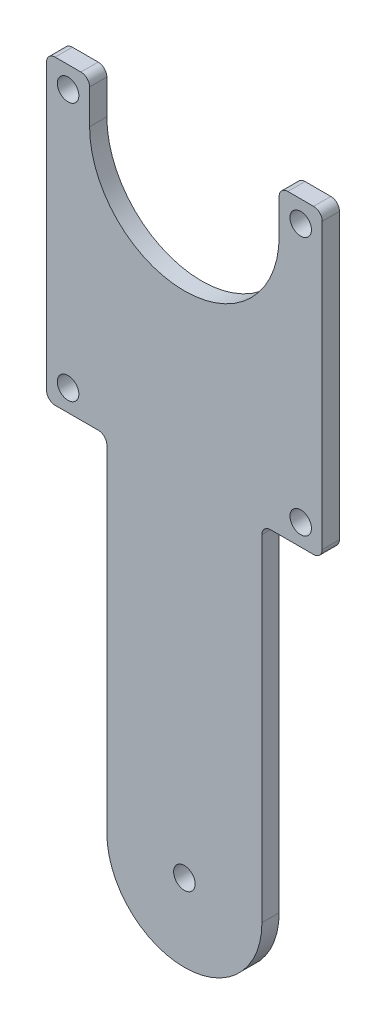
ISO-10303-21;
HEADER;
FILE_DESCRIPTION(('STEP AP214'),'2;1');
FILE_NAME('part.step','',(''),(''),'','','');
FILE_SCHEMA(('AUTOMOTIVE_DESIGN { 1 0 10303 214 1 1 1 1 }'));
ENDSEC;
DATA;
#1=APPLICATION_CONTEXT('core data for automotive mechanical design processes');
#2=APPLICATION_PROTOCOL_DEFINITION('international standard','automotive_design',2000,#1);
#3=PRODUCT_CONTEXT('',#1,'mechanical');
#4=PRODUCT('Part','Part','',(#3));
#5=PRODUCT_RELATED_PRODUCT_CATEGORY('part','',(#4));
#6=PRODUCT_DEFINITION_FORMATION('','',#4);
#7=PRODUCT_DEFINITION_CONTEXT('part definition',#1,'design');
#8=PRODUCT_DEFINITION('design','',#6,#7);
#9=PRODUCT_DEFINITION_SHAPE('','',#8);
#10=(LENGTH_UNIT() NAMED_UNIT(*) SI_UNIT(.MILLI.,.METRE.));
#11=(NAMED_UNIT(*) PLANE_ANGLE_UNIT() SI_UNIT($,.RADIAN.));
#12=(NAMED_UNIT(*) SI_UNIT($,.STERADIAN.) SOLID_ANGLE_UNIT());
#13=UNCERTAINTY_MEASURE_WITH_UNIT(LENGTH_MEASURE(1.E-05),#10,'distance_accuracy_value','');
#14=(GEOMETRIC_REPRESENTATION_CONTEXT(3) GLOBAL_UNCERTAINTY_ASSIGNED_CONTEXT((#13)) GLOBAL_UNIT_ASSIGNED_CONTEXT((#10,
#11,#12)) REPRESENTATION_CONTEXT('',''));
#15=CARTESIAN_POINT('',(0.,0.,0.));
#16=DIRECTION('',(0.,0.,1.));
#17=DIRECTION('',(1.,0.,0.));
#18=AXIS2_PLACEMENT_3D('',#15,#16,#17);
#19=CARTESIAN_POINT('',(23.0486139328405,-14.404186251909,2.));
#20=DIRECTION('',(0.,0.,-1.));
#21=DIRECTION('',(-1.,0.,0.));
#22=AXIS2_PLACEMENT_3D('',#19,#20,#21);
#23=CYLINDRICAL_SURFACE('',#22,1.);
#24=CARTESIAN_POINT('',(23.0486139328405,-14.404186251909,0.));
#25=DIRECTION('',(0.,0.,1.));
#26=DIRECTION('',(1.,0.,0.));
#27=AXIS2_PLACEMENT_3D('',#24,#25,#26);
#28=CIRCLE('',#27,1.);
#29=CARTESIAN_POINT('',(24.0486139328405,-14.404186251909,0.));
#30=VERTEX_POINT('',#29);
#31=CARTESIAN_POINT('',(23.0486139328405,-15.404186251909,0.));
#32=VERTEX_POINT('',#31);
#33=EDGE_CURVE('E214',#30,#32,#28,.F.);
#34=ORIENTED_EDGE('',*,*,#33,.F.);
#35=DIRECTION('',(0.,0.,-1.));
#36=VECTOR('',#35,1.);
#37=CARTESIAN_POINT('',(24.0486139328405,-14.404186251909,2.));
#38=LINE('',#37,#36);
#39=CARTESIAN_POINT('',(24.0486139328405,-14.404186251909,2.));
#40=VERTEX_POINT('',#39);
#41=EDGE_CURVE('E11',#40,#30,#38,.T.);
#42=ORIENTED_EDGE('',*,*,#41,.F.);
#43=CARTESIAN_POINT('',(23.0486139328405,-14.404186251909,2.));
#44=DIRECTION('',(0.,0.,1.));
#45=DIRECTION('',(1.,0.,0.));
#46=AXIS2_PLACEMENT_3D('',#43,#44,#45);
#47=CIRCLE('',#46,1.);
#48=CARTESIAN_POINT('',(23.0486139328405,-15.404186251909,2.));
#49=VERTEX_POINT('',#48);
#50=EDGE_CURVE('E276',#40,#49,#47,.F.);
#51=ORIENTED_EDGE('',*,*,#50,.T.);
#52=DIRECTION('',(0.,0.,-1.));
#53=VECTOR('',#52,1.);
#54=CARTESIAN_POINT('',(23.0486139328405,-15.404186251909,2.));
#55=LINE('',#54,#53);
#56=EDGE_CURVE('E50',#49,#32,#55,.T.);
#57=ORIENTED_EDGE('',*,*,#56,.T.);
#58=EDGE_LOOP('',(#34,#42,#51,#57));
#59=FACE_BOUND('',#58,.T.);
#60=ADVANCED_FACE('F34',(#59),#23,.T.);
#61=CARTESIAN_POINT('',(24.0486139328405,0.,2.));
#62=DIRECTION('',(1.,0.,0.));
#63=DIRECTION('',(0.,1.,0.));
#64=AXIS2_PLACEMENT_3D('',#61,#62,#63);
#65=PLANE('',#64);
#66=DIRECTION('',(0.,-1.,0.));
#67=VECTOR('',#66,1.);
#68=CARTESIAN_POINT('',(24.0486139328405,0.,0.));
#69=LINE('',#68,#67);
#70=CARTESIAN_POINT('',(24.0486139328405,18.595813748091,0.));
#71=VERTEX_POINT('',#70);
#72=EDGE_CURVE('E216',#71,#30,#69,.T.);
#73=ORIENTED_EDGE('',*,*,#72,.F.);
#74=DIRECTION('',(0.,0.,-1.));
#75=VECTOR('',#74,1.);
#76=CARTESIAN_POINT('',(24.0486139328405,18.595813748091,2.));
#77=LINE('',#76,#75);
#78=CARTESIAN_POINT('',(24.0486139328405,18.595813748091,2.));
#79=VERTEX_POINT('',#78);
#80=EDGE_CURVE('E42',#79,#71,#77,.T.);
#81=ORIENTED_EDGE('',*,*,#80,.F.);
#82=DIRECTION('',(0.,-1.,0.));
#83=VECTOR('',#82,1.);
#84=CARTESIAN_POINT('',(24.0486139328405,0.,2.));
#85=LINE('',#84,#83);
#86=EDGE_CURVE('E339',#79,#40,#85,.T.);
#87=ORIENTED_EDGE('',*,*,#86,.T.);
#88=ORIENTED_EDGE('',*,*,#41,.T.);
#89=EDGE_LOOP('',(#73,#81,#87,#88));
#90=FACE_BOUND('',#89,.T.);
#91=ADVANCED_FACE('F326',(#90),#65,.T.);
#92=CARTESIAN_POINT('',(23.0486139328405,18.595813748091,2.));
#93=DIRECTION('',(0.,0.,-1.));
#94=DIRECTION('',(-1.,0.,0.));
#95=AXIS2_PLACEMENT_3D('',#92,#93,#94);
#96=CYLINDRICAL_SURFACE('',#95,1.);
#97=CARTESIAN_POINT('',(23.0486139328405,18.595813748091,0.));
#98=DIRECTION('',(0.,0.,1.));
#99=DIRECTION('',(1.,0.,0.));
#100=AXIS2_PLACEMENT_3D('',#97,#98,#99);
#101=CIRCLE('',#100,1.);
#102=CARTESIAN_POINT('',(23.0486139328405,19.595813748091,0.));
#103=VERTEX_POINT('',#102);
#104=EDGE_CURVE('E219',#103,#71,#101,.F.);
#105=ORIENTED_EDGE('',*,*,#104,.F.);
#106=DIRECTION('',(0.,0.,-1.));
#107=VECTOR('',#106,1.);
#108=CARTESIAN_POINT('',(23.0486139328405,19.595813748091,2.));
#109=LINE('',#108,#107);
#110=CARTESIAN_POINT('',(23.0486139328405,19.595813748091,2.));
#111=VERTEX_POINT('',#110);
#112=EDGE_CURVE('E315',#111,#103,#109,.T.);
#113=ORIENTED_EDGE('',*,*,#112,.F.);
#114=CARTESIAN_POINT('',(23.0486139328405,18.595813748091,2.));
#115=DIRECTION('',(0.,0.,1.));
#116=DIRECTION('',(1.,0.,0.));
#117=AXIS2_PLACEMENT_3D('',#114,#115,#116);
#118=CIRCLE('',#117,1.);
#119=EDGE_CURVE('E322',#111,#79,#118,.F.);
#120=ORIENTED_EDGE('',*,*,#119,.T.);
#121=ORIENTED_EDGE('',*,*,#80,.T.);
#122=EDGE_LOOP('',(#105,#113,#120,#121));
#123=FACE_BOUND('',#122,.T.);
#124=ADVANCED_FACE('F320',(#123),#96,.T.);
#125=CARTESIAN_POINT('',(0.,19.595813748091,2.));
#126=DIRECTION('',(0.,1.,0.));
#127=DIRECTION('',(0.,0.,1.));
#128=AXIS2_PLACEMENT_3D('',#125,#126,#127);
#129=PLANE('',#128);
#130=DIRECTION('',(1.,0.,0.));
#131=VECTOR('',#130,1.);
#132=CARTESIAN_POINT('',(0.,19.595813748091,0.));
#133=LINE('',#132,#131);
#134=CARTESIAN_POINT('',(20.0486139328405,19.595813748091,0.));
#135=VERTEX_POINT('',#134);
#136=EDGE_CURVE('E222',#135,#103,#133,.T.);
#137=ORIENTED_EDGE('',*,*,#136,.F.);
#138=DIRECTION('',(0.,0.,-1.));
#139=VECTOR('',#138,1.);
#140=CARTESIAN_POINT('',(20.0486139328405,19.595813748091,2.));
#141=LINE('',#140,#139);
#142=CARTESIAN_POINT('',(20.0486139328405,19.595813748091,2.));
#143=VERTEX_POINT('',#142);
#144=EDGE_CURVE('E313',#143,#135,#141,.T.);
#145=ORIENTED_EDGE('',*,*,#144,.F.);
#146=DIRECTION('',(1.,0.,0.));
#147=VECTOR('',#146,1.);
#148=CARTESIAN_POINT('',(0.,19.595813748091,2.));
#149=LINE('',#148,#147);
#150=EDGE_CURVE('E338',#143,#111,#149,.T.);
#151=ORIENTED_EDGE('',*,*,#150,.T.);
#152=ORIENTED_EDGE('',*,*,#112,.T.);
#153=EDGE_LOOP('',(#137,#145,#151,#152));
#154=FACE_BOUND('',#153,.T.);
#155=ADVANCED_FACE('F334',(#154),#129,.T.);
#156=CARTESIAN_POINT('',(20.0486139328405,18.595813748091,2.));
#157=DIRECTION('',(0.,0.,-1.));
#158=DIRECTION('',(-1.,0.,0.));
#159=AXIS2_PLACEMENT_3D('',#156,#157,#158);
#160=CYLINDRICAL_SURFACE('',#159,1.);
#161=CARTESIAN_POINT('',(20.0486139328405,18.595813748091,0.));
#162=DIRECTION('',(0.,0.,1.));
#163=DIRECTION('',(1.,0.,0.));
#164=AXIS2_PLACEMENT_3D('',#161,#162,#163);
#165=CIRCLE('',#164,1.);
#166=CARTESIAN_POINT('',(19.0486139328405,18.595813748091,0.));
#167=VERTEX_POINT('',#166);
#168=EDGE_CURVE('E225',#135,#167,#165,.T.);
#169=ORIENTED_EDGE('',*,*,#168,.T.);
#170=DIRECTION('',(0.,0.,-1.));
#171=VECTOR('',#170,1.);
#172=CARTESIAN_POINT('',(19.0486139328405,18.595813748091,2.));
#173=LINE('',#172,#171);
#174=CARTESIAN_POINT('',(19.0486139328405,18.595813748091,2.));
#175=VERTEX_POINT('',#174);
#176=EDGE_CURVE('E310',#175,#167,#173,.T.);
#177=ORIENTED_EDGE('',*,*,#176,.F.);
#178=CARTESIAN_POINT('',(20.0486139328405,18.595813748091,2.));
#179=DIRECTION('',(0.,0.,1.));
#180=DIRECTION('',(1.,0.,0.));
#181=AXIS2_PLACEMENT_3D('',#178,#179,#180);
#182=CIRCLE('',#181,1.);
#183=EDGE_CURVE('E341',#143,#175,#182,.T.);
#184=ORIENTED_EDGE('',*,*,#183,.F.);
#185=ORIENTED_EDGE('',*,*,#144,.T.);
#186=EDGE_LOOP('',(#169,#177,#184,#185));
#187=FACE_BOUND('',#186,.T.);
#188=ADVANCED_FACE('F406',(#187),#160,.T.);
#189=CARTESIAN_POINT('',(19.0486139328405,0.,2.));
#190=DIRECTION('',(1.,0.,0.));
#191=DIRECTION('',(0.,0.,-1.));
#192=AXIS2_PLACEMENT_3D('',#189,#190,#191);
#193=PLANE('',#192);
#194=DIRECTION('',(0.,-1.,0.));
#195=VECTOR('',#194,1.);
#196=CARTESIAN_POINT('',(19.0486139328405,0.,0.));
#197=LINE('',#196,#195);
#198=CARTESIAN_POINT('',(19.0486139328405,14.595813748091,0.));
#199=VERTEX_POINT('',#198);
#200=EDGE_CURVE('E227',#167,#199,#197,.T.);
#201=ORIENTED_EDGE('',*,*,#200,.T.);
#202=DIRECTION('',(0.,0.,-1.));
#203=VECTOR('',#202,1.);
#204=CARTESIAN_POINT('',(19.0486139328405,14.595813748091,2.));
#205=LINE('',#204,#203);
#206=CARTESIAN_POINT('',(19.0486139328405,14.595813748091,2.));
#207=VERTEX_POINT('',#206);
#208=EDGE_CURVE('E307',#207,#199,#205,.T.);
#209=ORIENTED_EDGE('',*,*,#208,.F.);
#210=DIRECTION('',(0.,-1.,0.));
#211=VECTOR('',#210,1.);
#212=CARTESIAN_POINT('',(19.0486139328405,0.,2.));
#213=LINE('',#212,#211);
#214=EDGE_CURVE('E347',#175,#207,#213,.T.);
#215=ORIENTED_EDGE('',*,*,#214,.F.);
#216=ORIENTED_EDGE('',*,*,#176,.T.);
#217=EDGE_LOOP('',(#201,#209,#215,#216));
#218=FACE_BOUND('',#217,.T.);
#219=ADVANCED_FACE('F409',(#218),#193,.F.);
#220=CARTESIAN_POINT('',(8.04861393284049,14.595813748091,2.));
#221=DIRECTION('',(0.,0.,-1.));
#222=DIRECTION('',(-1.,0.,0.));
#223=AXIS2_PLACEMENT_3D('',#220,#221,#222);
#224=CYLINDRICAL_SURFACE('',#223,11.);
#225=CARTESIAN_POINT('',(8.04861393284049,14.595813748091,0.));
#226=DIRECTION('',(0.,0.,1.));
#227=DIRECTION('',(1.,0.,0.));
#228=AXIS2_PLACEMENT_3D('',#225,#226,#227);
#229=CIRCLE('',#228,11.);
#230=CARTESIAN_POINT('',(-2.95138606715951,14.595813748091,0.));
#231=VERTEX_POINT('',#230);
#232=EDGE_CURVE('E229',#199,#231,#229,.F.);
#233=ORIENTED_EDGE('',*,*,#232,.T.);
#234=DIRECTION('',(0.,0.,-1.));
#235=VECTOR('',#234,1.);
#236=CARTESIAN_POINT('',(-2.95138606715951,14.595813748091,2.));
#237=LINE('',#236,#235);
#238=CARTESIAN_POINT('',(-2.95138606715951,14.595813748091,2.));
#239=VERTEX_POINT('',#238);
#240=EDGE_CURVE('E304',#239,#231,#237,.T.);
#241=ORIENTED_EDGE('',*,*,#240,.F.);
#242=CARTESIAN_POINT('',(8.04861393284049,14.595813748091,2.));
#243=DIRECTION('',(0.,0.,1.));
#244=DIRECTION('',(1.,0.,0.));
#245=AXIS2_PLACEMENT_3D('',#242,#243,#244);
#246=CIRCLE('',#245,11.);
#247=EDGE_CURVE('E349',#207,#239,#246,.F.);
#248=ORIENTED_EDGE('',*,*,#247,.F.);
#249=ORIENTED_EDGE('',*,*,#208,.T.);
#250=EDGE_LOOP('',(#233,#241,#248,#249));
#251=FACE_BOUND('',#250,.T.);
#252=ADVANCED_FACE('F413',(#251),#224,.F.);
#253=CARTESIAN_POINT('',(-2.95138606715951,0.,2.));
#254=DIRECTION('',(-1.,0.,0.));
#255=DIRECTION('',(0.,0.,1.));
#256=AXIS2_PLACEMENT_3D('',#253,#254,#255);
#257=PLANE('',#256);
#258=DIRECTION('',(0.,1.,0.));
#259=VECTOR('',#258,1.);
#260=CARTESIAN_POINT('',(-2.95138606715951,0.,0.));
#261=LINE('',#260,#259);
#262=CARTESIAN_POINT('',(-2.95138606715951,18.595813748091,0.));
#263=VERTEX_POINT('',#262);
#264=EDGE_CURVE('E231',#231,#263,#261,.T.);
#265=ORIENTED_EDGE('',*,*,#264,.T.);
#266=DIRECTION('',(0.,0.,-1.));
#267=VECTOR('',#266,1.);
#268=CARTESIAN_POINT('',(-2.95138606715951,18.595813748091,2.));
#269=LINE('',#268,#267);
#270=CARTESIAN_POINT('',(-2.95138606715951,18.595813748091,2.));
#271=VERTEX_POINT('',#270);
#272=EDGE_CURVE('E302',#271,#263,#269,.T.);
#273=ORIENTED_EDGE('',*,*,#272,.F.);
#274=DIRECTION('',(0.,1.,0.));
#275=VECTOR('',#274,1.);
#276=CARTESIAN_POINT('',(-2.95138606715951,0.,2.));
#277=LINE('',#276,#275);
#278=EDGE_CURVE('E351',#239,#271,#277,.T.);
#279=ORIENTED_EDGE('',*,*,#278,.F.);
#280=ORIENTED_EDGE('',*,*,#240,.T.);
#281=EDGE_LOOP('',(#265,#273,#279,#280));
#282=FACE_BOUND('',#281,.T.);
#283=ADVANCED_FACE('F417',(#282),#257,.F.);
#284=CARTESIAN_POINT('',(-3.95138606715951,18.595813748091,2.));
#285=DIRECTION('',(0.,0.,-1.));
#286=DIRECTION('',(-1.,0.,0.));
#287=AXIS2_PLACEMENT_3D('',#284,#285,#286);
#288=CYLINDRICAL_SURFACE('',#287,1.);
#289=CARTESIAN_POINT('',(-3.95138606715951,18.595813748091,0.));
#290=DIRECTION('',(0.,0.,1.));
#291=DIRECTION('',(1.,0.,0.));
#292=AXIS2_PLACEMENT_3D('',#289,#290,#291);
#293=CIRCLE('',#292,1.);
#294=CARTESIAN_POINT('',(-3.95138606715952,19.595813748091,0.));
#295=VERTEX_POINT('',#294);
#296=EDGE_CURVE('E234',#295,#263,#293,.F.);
#297=ORIENTED_EDGE('',*,*,#296,.F.);
#298=DIRECTION('',(0.,0.,-1.));
#299=VECTOR('',#298,1.);
#300=CARTESIAN_POINT('',(-3.95138606715952,19.595813748091,2.));
#301=LINE('',#300,#299);
#302=CARTESIAN_POINT('',(-3.95138606715952,19.595813748091,2.));
#303=VERTEX_POINT('',#302);
#304=EDGE_CURVE('E300',#303,#295,#301,.T.);
#305=ORIENTED_EDGE('',*,*,#304,.F.);
#306=CARTESIAN_POINT('',(-3.95138606715951,18.595813748091,2.));
#307=DIRECTION('',(0.,0.,1.));
#308=DIRECTION('',(1.,0.,0.));
#309=AXIS2_PLACEMENT_3D('',#306,#307,#308);
#310=CIRCLE('',#309,1.);
#311=EDGE_CURVE('E353',#303,#271,#310,.F.);
#312=ORIENTED_EDGE('',*,*,#311,.T.);
#313=ORIENTED_EDGE('',*,*,#272,.T.);
#314=EDGE_LOOP('',(#297,#305,#312,#313));
#315=FACE_BOUND('',#314,.T.);
#316=ADVANCED_FACE('F421',(#315),#288,.T.);
#317=CARTESIAN_POINT('',(0.,19.595813748091,2.));
#318=DIRECTION('',(0.,1.,0.));
#319=DIRECTION('',(-1.,0.,0.));
#320=AXIS2_PLACEMENT_3D('',#317,#318,#319);
#321=PLANE('',#320);
#322=DIRECTION('',(1.,0.,0.));
#323=VECTOR('',#322,1.);
#324=CARTESIAN_POINT('',(0.,19.595813748091,0.));
#325=LINE('',#324,#323);
#326=CARTESIAN_POINT('',(-6.95138606715951,19.595813748091,0.));
#327=VERTEX_POINT('',#326);
#328=EDGE_CURVE('E237',#327,#295,#325,.T.);
#329=ORIENTED_EDGE('',*,*,#328,.F.);
#330=DIRECTION('',(0.,0.,-1.));
#331=VECTOR('',#330,1.);
#332=CARTESIAN_POINT('',(-6.95138606715951,19.595813748091,2.));
#333=LINE('',#332,#331);
#334=CARTESIAN_POINT('',(-6.95138606715951,19.595813748091,2.));
#335=VERTEX_POINT('',#334);
#336=EDGE_CURVE('E298',#335,#327,#333,.T.);
#337=ORIENTED_EDGE('',*,*,#336,.F.);
#338=DIRECTION('',(1.,0.,0.));
#339=VECTOR('',#338,1.);
#340=CARTESIAN_POINT('',(0.,19.595813748091,2.));
#341=LINE('',#340,#339);
#342=EDGE_CURVE('E356',#335,#303,#341,.T.);
#343=ORIENTED_EDGE('',*,*,#342,.T.);
#344=ORIENTED_EDGE('',*,*,#304,.T.);
#345=EDGE_LOOP('',(#329,#337,#343,#344));
#346=FACE_BOUND('',#345,.T.);
#347=ADVANCED_FACE('F425',(#346),#321,.T.);
#348=CARTESIAN_POINT('',(-6.95138606715952,18.595813748091,2.));
#349=DIRECTION('',(0.,0.,-1.));
#350=DIRECTION('',(-1.,0.,0.));
#351=AXIS2_PLACEMENT_3D('',#348,#349,#350);
#352=CYLINDRICAL_SURFACE('',#351,0.999999999999999);
#353=CARTESIAN_POINT('',(-6.95138606715952,18.595813748091,0.));
#354=DIRECTION('',(0.,0.,1.));
#355=DIRECTION('',(1.,0.,0.));
#356=AXIS2_PLACEMENT_3D('',#353,#354,#355);
#357=CIRCLE('',#356,0.999999999999999);
#358=CARTESIAN_POINT('',(-7.95138606715952,18.595813748091,0.));
#359=VERTEX_POINT('',#358);
#360=EDGE_CURVE('E240',#327,#359,#357,.T.);
#361=ORIENTED_EDGE('',*,*,#360,.T.);
#362=DIRECTION('',(0.,0.,-1.));
#363=VECTOR('',#362,1.);
#364=CARTESIAN_POINT('',(-7.95138606715952,18.595813748091,2.));
#365=LINE('',#364,#363);
#366=CARTESIAN_POINT('',(-7.95138606715952,18.595813748091,2.));
#367=VERTEX_POINT('',#366);
#368=EDGE_CURVE('E295',#367,#359,#365,.T.);
#369=ORIENTED_EDGE('',*,*,#368,.F.);
#370=CARTESIAN_POINT('',(-6.95138606715952,18.595813748091,2.));
#371=DIRECTION('',(0.,0.,1.));
#372=DIRECTION('',(1.,0.,0.));
#373=AXIS2_PLACEMENT_3D('',#370,#371,#372);
#374=CIRCLE('',#373,0.999999999999999);
#375=EDGE_CURVE('E359',#335,#367,#374,.T.);
#376=ORIENTED_EDGE('',*,*,#375,.F.);
#377=ORIENTED_EDGE('',*,*,#336,.T.);
#378=EDGE_LOOP('',(#361,#369,#376,#377));
#379=FACE_BOUND('',#378,.T.);
#380=ADVANCED_FACE('F429',(#379),#352,.T.);
#381=CARTESIAN_POINT('',(-7.95138606715951,0.,2.));
#382=DIRECTION('',(1.,0.,0.));
#383=DIRECTION('',(0.,1.,0.));
#384=AXIS2_PLACEMENT_3D('',#381,#382,#383);
#385=PLANE('',#384);
#386=DIRECTION('',(0.,-1.,0.));
#387=VECTOR('',#386,1.);
#388=CARTESIAN_POINT('',(-7.95138606715951,0.,0.));
#389=LINE('',#388,#387);
#390=CARTESIAN_POINT('',(-7.95138606715951,-14.404186251909,0.));
#391=VERTEX_POINT('',#390);
#392=EDGE_CURVE('E242',#359,#391,#389,.T.);
#393=ORIENTED_EDGE('',*,*,#392,.T.);
#394=DIRECTION('',(0.,0.,-1.));
#395=VECTOR('',#394,1.);
#396=CARTESIAN_POINT('',(-7.95138606715951,-14.404186251909,2.));
#397=LINE('',#396,#395);
#398=CARTESIAN_POINT('',(-7.95138606715951,-14.404186251909,2.));
#399=VERTEX_POINT('',#398);
#400=EDGE_CURVE('E292',#399,#391,#397,.T.);
#401=ORIENTED_EDGE('',*,*,#400,.F.);
#402=DIRECTION('',(0.,-1.,0.));
#403=VECTOR('',#402,1.);
#404=CARTESIAN_POINT('',(-7.95138606715951,0.,2.));
#405=LINE('',#404,#403);
#406=EDGE_CURVE('E361',#367,#399,#405,.T.);
#407=ORIENTED_EDGE('',*,*,#406,.F.);
#408=ORIENTED_EDGE('',*,*,#368,.T.);
#409=EDGE_LOOP('',(#393,#401,#407,#408));
#410=FACE_BOUND('',#409,.T.);
#411=ADVANCED_FACE('F433',(#410),#385,.F.);
#412=CARTESIAN_POINT('',(-6.95138606715951,-14.404186251909,2.));
#413=DIRECTION('',(0.,0.,-1.));
#414=DIRECTION('',(-1.,0.,0.));
#415=AXIS2_PLACEMENT_3D('',#412,#413,#414);
#416=CYLINDRICAL_SURFACE('',#415,1.);
#417=CARTESIAN_POINT('',(-6.95138606715951,-14.404186251909,0.));
#418=DIRECTION('',(0.,0.,1.));
#419=DIRECTION('',(1.,0.,0.));
#420=AXIS2_PLACEMENT_3D('',#417,#418,#419);
#421=CIRCLE('',#420,1.);
#422=CARTESIAN_POINT('',(-6.9513860671595,-15.404186251909,0.));
#423=VERTEX_POINT('',#422);
#424=EDGE_CURVE('E244',#391,#423,#421,.T.);
#425=ORIENTED_EDGE('',*,*,#424,.T.);
#426=DIRECTION('',(0.,0.,-1.));
#427=VECTOR('',#426,1.);
#428=CARTESIAN_POINT('',(-6.9513860671595,-15.404186251909,2.));
#429=LINE('',#428,#427);
#430=CARTESIAN_POINT('',(-6.9513860671595,-15.404186251909,2.));
#431=VERTEX_POINT('',#430);
#432=EDGE_CURVE('E289',#431,#423,#429,.T.);
#433=ORIENTED_EDGE('',*,*,#432,.F.);
#434=CARTESIAN_POINT('',(-6.95138606715951,-14.404186251909,2.));
#435=DIRECTION('',(0.,0.,1.));
#436=DIRECTION('',(1.,0.,0.));
#437=AXIS2_PLACEMENT_3D('',#434,#435,#436);
#438=CIRCLE('',#437,1.);
#439=EDGE_CURVE('E363',#399,#431,#438,.T.);
#440=ORIENTED_EDGE('',*,*,#439,.F.);
#441=ORIENTED_EDGE('',*,*,#400,.T.);
#442=EDGE_LOOP('',(#425,#433,#440,#441));
#443=FACE_BOUND('',#442,.T.);
#444=ADVANCED_FACE('F437',(#443),#416,.T.);
#445=CARTESIAN_POINT('',(0.,-15.404186251909,2.));
#446=DIRECTION('',(0.,1.,0.));
#447=DIRECTION('',(0.,0.,1.));
#448=AXIS2_PLACEMENT_3D('',#445,#446,#447);
#449=PLANE('',#448);
#450=DIRECTION('',(1.,0.,0.));
#451=VECTOR('',#450,1.);
#452=CARTESIAN_POINT('',(0.,-15.404186251909,0.));
#453=LINE('',#452,#451);
#454=CARTESIAN_POINT('',(-1.95138606715951,-15.404186251909,0.));
#455=VERTEX_POINT('',#454);
#456=EDGE_CURVE('E246',#423,#455,#453,.T.);
#457=ORIENTED_EDGE('',*,*,#456,.T.);
#458=DIRECTION('',(0.,0.,-1.));
#459=VECTOR('',#458,1.);
#460=CARTESIAN_POINT('',(-1.95138606715951,-15.404186251909,2.));
#461=LINE('',#460,#459);
#462=CARTESIAN_POINT('',(-1.95138606715951,-15.404186251909,2.));
#463=VERTEX_POINT('',#462);
#464=EDGE_CURVE('E286',#463,#455,#461,.T.);
#465=ORIENTED_EDGE('',*,*,#464,.F.);
#466=DIRECTION('',(1.,0.,0.));
#467=VECTOR('',#466,1.);
#468=CARTESIAN_POINT('',(0.,-15.404186251909,2.));
#469=LINE('',#468,#467);
#470=EDGE_CURVE('E365',#431,#463,#469,.T.);
#471=ORIENTED_EDGE('',*,*,#470,.F.);
#472=ORIENTED_EDGE('',*,*,#432,.T.);
#473=EDGE_LOOP('',(#457,#465,#471,#472));
#474=FACE_BOUND('',#473,.T.);
#475=ADVANCED_FACE('F441',(#474),#449,.F.);
#476=CARTESIAN_POINT('',(-1.9513860671595,-16.404186251909,2.));
#477=DIRECTION('',(0.,0.,-1.));
#478=DIRECTION('',(-1.,0.,0.));
#479=AXIS2_PLACEMENT_3D('',#476,#477,#478);
#480=CYLINDRICAL_SURFACE('',#479,1.);
#481=CARTESIAN_POINT('',(-1.9513860671595,-16.404186251909,0.));
#482=DIRECTION('',(0.,0.,1.));
#483=DIRECTION('',(1.,0.,0.));
#484=AXIS2_PLACEMENT_3D('',#481,#482,#483);
#485=CIRCLE('',#484,1.);
#486=CARTESIAN_POINT('',(-0.951386067159503,-16.404186251909,0.));
#487=VERTEX_POINT('',#486);
#488=EDGE_CURVE('E248',#455,#487,#485,.F.);
#489=ORIENTED_EDGE('',*,*,#488,.T.);
#490=DIRECTION('',(0.,0.,-1.));
#491=VECTOR('',#490,1.);
#492=CARTESIAN_POINT('',(-0.951386067159503,-16.404186251909,2.));
#493=LINE('',#492,#491);
#494=CARTESIAN_POINT('',(-0.951386067159503,-16.404186251909,2.));
#495=VERTEX_POINT('',#494);
#496=EDGE_CURVE('E283',#495,#487,#493,.T.);
#497=ORIENTED_EDGE('',*,*,#496,.F.);
#498=CARTESIAN_POINT('',(-1.9513860671595,-16.404186251909,2.));
#499=DIRECTION('',(0.,0.,1.));
#500=DIRECTION('',(1.,0.,0.));
#501=AXIS2_PLACEMENT_3D('',#498,#499,#500);
#502=CIRCLE('',#501,1.);
#503=EDGE_CURVE('E367',#463,#495,#502,.F.);
#504=ORIENTED_EDGE('',*,*,#503,.F.);
#505=ORIENTED_EDGE('',*,*,#464,.T.);
#506=EDGE_LOOP('',(#489,#497,#504,#505));
#507=FACE_BOUND('',#506,.T.);
#508=ADVANCED_FACE('F445',(#507),#480,.F.);
#509=CARTESIAN_POINT('',(-0.951386067159505,0.,2.));
#510=DIRECTION('',(1.,0.,0.));
#511=DIRECTION('',(0.,1.,0.));
#512=AXIS2_PLACEMENT_3D('',#509,#510,#511);
#513=PLANE('',#512);
#514=DIRECTION('',(0.,-1.,0.));
#515=VECTOR('',#514,1.);
#516=CARTESIAN_POINT('',(-0.951386067159505,0.,0.));
#517=LINE('',#516,#515);
#518=CARTESIAN_POINT('',(-0.951386067159499,-55.404186251909,0.));
#519=VERTEX_POINT('',#518);
#520=EDGE_CURVE('E250',#487,#519,#517,.T.);
#521=ORIENTED_EDGE('',*,*,#520,.T.);
#522=DIRECTION('',(0.,0.,-1.));
#523=VECTOR('',#522,1.);
#524=CARTESIAN_POINT('',(-0.951386067159499,-55.404186251909,2.));
#525=LINE('',#524,#523);
#526=CARTESIAN_POINT('',(-0.951386067159499,-55.404186251909,2.));
#527=VERTEX_POINT('',#526);
#528=EDGE_CURVE('E280',#527,#519,#525,.T.);
#529=ORIENTED_EDGE('',*,*,#528,.F.);
#530=DIRECTION('',(0.,-1.,0.));
#531=VECTOR('',#530,1.);
#532=CARTESIAN_POINT('',(-0.951386067159505,0.,2.));
#533=LINE('',#532,#531);
#534=EDGE_CURVE('E369',#495,#527,#533,.T.);
#535=ORIENTED_EDGE('',*,*,#534,.F.);
#536=ORIENTED_EDGE('',*,*,#496,.T.);
#537=EDGE_LOOP('',(#521,#529,#535,#536));
#538=FACE_BOUND('',#537,.T.);
#539=ADVANCED_FACE('F375',(#538),#513,.F.);
#540=CARTESIAN_POINT('',(8.04861393284051,-55.404186251909,2.));
#541=DIRECTION('',(0.,0.,-1.));
#542=DIRECTION('',(-1.,0.,0.));
#543=AXIS2_PLACEMENT_3D('',#540,#541,#542);
#544=CYLINDRICAL_SURFACE('',#543,9.);
#545=CARTESIAN_POINT('',(8.04861393284051,-55.404186251909,0.));
#546=DIRECTION('',(0.,0.,1.));
#547=DIRECTION('',(1.,0.,0.));
#548=AXIS2_PLACEMENT_3D('',#545,#546,#547);
#549=CIRCLE('',#548,9.);
#550=CARTESIAN_POINT('',(17.0486139328405,-55.404186251909,0.));
#551=VERTEX_POINT('',#550);
#552=EDGE_CURVE('E252',#519,#551,#549,.T.);
#553=ORIENTED_EDGE('',*,*,#552,.T.);
#554=DIRECTION('',(0.,0.,-1.));
#555=VECTOR('',#554,1.);
#556=CARTESIAN_POINT('',(17.0486139328405,-55.404186251909,2.));
#557=LINE('',#556,#555);
#558=CARTESIAN_POINT('',(17.0486139328405,-55.404186251909,2.));
#559=VERTEX_POINT('',#558);
#560=EDGE_CURVE('E181',#559,#551,#557,.T.);
#561=ORIENTED_EDGE('',*,*,#560,.F.);
#562=CARTESIAN_POINT('',(8.04861393284051,-55.404186251909,2.));
#563=DIRECTION('',(0.,0.,1.));
#564=DIRECTION('',(1.,0.,0.));
#565=AXIS2_PLACEMENT_3D('',#562,#563,#564);
#566=CIRCLE('',#565,9.);
#567=EDGE_CURVE('E190',#527,#559,#566,.T.);
#568=ORIENTED_EDGE('',*,*,#567,.F.);
#569=ORIENTED_EDGE('',*,*,#528,.T.);
#570=EDGE_LOOP('',(#553,#561,#568,#569));
#571=FACE_BOUND('',#570,.T.);
#572=ADVANCED_FACE('F379',(#571),#544,.T.);
#573=CARTESIAN_POINT('',(17.0486139328405,0.,2.));
#574=DIRECTION('',(1.,0.,0.));
#575=DIRECTION('',(0.,1.,0.));
#576=AXIS2_PLACEMENT_3D('',#573,#574,#575);
#577=PLANE('',#576);
#578=DIRECTION('',(0.,-1.,0.));
#579=VECTOR('',#578,1.);
#580=CARTESIAN_POINT('',(17.0486139328405,0.,0.));
#581=LINE('',#580,#579);
#582=CARTESIAN_POINT('',(17.0486139328405,-16.404186251909,0.));
#583=VERTEX_POINT('',#582);
#584=EDGE_CURVE('E177',#583,#551,#581,.T.);
#585=ORIENTED_EDGE('',*,*,#584,.F.);
#586=DIRECTION('',(0.,0.,-1.));
#587=VECTOR('',#586,1.);
#588=CARTESIAN_POINT('',(17.0486139328405,-16.404186251909,2.));
#589=LINE('',#588,#587);
#590=CARTESIAN_POINT('',(17.0486139328405,-16.404186251909,2.));
#591=VERTEX_POINT('',#590);
#592=EDGE_CURVE('E172',#591,#583,#589,.T.);
#593=ORIENTED_EDGE('',*,*,#592,.F.);
#594=DIRECTION('',(0.,-1.,0.));
#595=VECTOR('',#594,1.);
#596=CARTESIAN_POINT('',(17.0486139328405,0.,2.));
#597=LINE('',#596,#595);
#598=EDGE_CURVE('E175',#591,#559,#597,.T.);
#599=ORIENTED_EDGE('',*,*,#598,.T.);
#600=ORIENTED_EDGE('',*,*,#560,.T.);
#601=EDGE_LOOP('',(#585,#593,#599,#600));
#602=FACE_BOUND('',#601,.T.);
#603=ADVANCED_FACE('F174',(#602),#577,.T.);
#604=CARTESIAN_POINT('',(18.0486139328405,-16.404186251909,2.));
#605=DIRECTION('',(0.,0.,-1.));
#606=DIRECTION('',(-1.,0.,0.));
#607=AXIS2_PLACEMENT_3D('',#604,#605,#606);
#608=CYLINDRICAL_SURFACE('',#607,1.);
#609=CARTESIAN_POINT('',(18.0486139328405,-16.404186251909,0.));
#610=DIRECTION('',(0.,0.,1.));
#611=DIRECTION('',(1.,0.,0.));
#612=AXIS2_PLACEMENT_3D('',#609,#610,#611);
#613=CIRCLE('',#612,1.);
#614=CARTESIAN_POINT('',(18.0486139328405,-15.404186251909,0.));
#615=VERTEX_POINT('',#614);
#616=EDGE_CURVE('E256',#615,#583,#613,.T.);
#617=ORIENTED_EDGE('',*,*,#616,.F.);
#618=DIRECTION('',(0.,0.,-1.));
#619=VECTOR('',#618,1.);
#620=CARTESIAN_POINT('',(18.0486139328405,-15.404186251909,2.));
#621=LINE('',#620,#619);
#622=CARTESIAN_POINT('',(18.0486139328405,-15.404186251909,2.));
#623=VERTEX_POINT('',#622);
#624=EDGE_CURVE('E111',#623,#615,#621,.T.);
#625=ORIENTED_EDGE('',*,*,#624,.F.);
#626=CARTESIAN_POINT('',(18.0486139328405,-16.404186251909,2.));
#627=DIRECTION('',(0.,0.,1.));
#628=DIRECTION('',(1.,0.,0.));
#629=AXIS2_PLACEMENT_3D('',#626,#627,#628);
#630=CIRCLE('',#629,1.);
#631=EDGE_CURVE('E188',#623,#591,#630,.T.);
#632=ORIENTED_EDGE('',*,*,#631,.T.);
#633=ORIENTED_EDGE('',*,*,#592,.T.);
#634=EDGE_LOOP('',(#617,#625,#632,#633));
#635=FACE_BOUND('',#634,.T.);
#636=ADVANCED_FACE('F193',(#635),#608,.F.);
#637=CARTESIAN_POINT('',(21.5486139328405,-12.904186251909,2.));
#638=DIRECTION('',(0.,0.,-1.));
#639=DIRECTION('',(-1.,0.,0.));
#640=AXIS2_PLACEMENT_3D('',#637,#638,#639);
#641=CYLINDRICAL_SURFACE('',#640,1.25);
#642=CARTESIAN_POINT('',(21.5486139328405,-12.904186251909,2.));
#643=DIRECTION('',(0.,0.,1.));
#644=DIRECTION('',(1.,0.,0.));
#645=AXIS2_PLACEMENT_3D('',#642,#643,#644);
#646=CIRCLE('',#645,1.25);
#647=CARTESIAN_POINT('',(22.7986139328405,-12.904186251909,2.));
#648=VERTEX_POINT('',#647);
#649=EDGE_CURVE('E208',#648,#648,#646,.T.);
#650=ORIENTED_EDGE('',*,*,#649,.T.);
#651=EDGE_LOOP('',(#650));
#652=FACE_BOUND('',#651,.T.);
#653=CARTESIAN_POINT('',(21.5486139328405,-12.904186251909,0.));
#654=DIRECTION('',(0.,0.,1.));
#655=DIRECTION('',(1.,0.,0.));
#656=AXIS2_PLACEMENT_3D('',#653,#654,#655);
#657=CIRCLE('',#656,1.25);
#658=CARTESIAN_POINT('',(22.7986139328405,-12.904186251909,0.));
#659=VERTEX_POINT('',#658);
#660=EDGE_CURVE('E270',#659,#659,#657,.T.);
#661=ORIENTED_EDGE('',*,*,#660,.F.);
#662=EDGE_LOOP('',(#661));
#663=FACE_BOUND('',#662,.T.);
#664=ADVANCED_FACE('F456',(#652,#663),#641,.F.);
#665=CARTESIAN_POINT('',(-5.45138606715951,17.095813748091,2.));
#666=DIRECTION('',(0.,0.,-1.));
#667=DIRECTION('',(-1.,0.,0.));
#668=AXIS2_PLACEMENT_3D('',#665,#666,#667);
#669=CYLINDRICAL_SURFACE('',#668,1.25);
#670=CARTESIAN_POINT('',(-5.45138606715951,17.095813748091,2.));
#671=DIRECTION('',(0.,0.,1.));
#672=DIRECTION('',(1.,0.,0.));
#673=AXIS2_PLACEMENT_3D('',#670,#671,#672);
#674=CIRCLE('',#673,1.25);
#675=CARTESIAN_POINT('',(-4.20138606715951,17.095813748091,2.));
#676=VERTEX_POINT('',#675);
#677=EDGE_CURVE('E205',#676,#676,#674,.T.);
#678=ORIENTED_EDGE('',*,*,#677,.T.);
#679=EDGE_LOOP('',(#678));
#680=FACE_BOUND('',#679,.T.);
#681=CARTESIAN_POINT('',(-5.45138606715951,17.095813748091,0.));
#682=DIRECTION('',(0.,0.,1.));
#683=DIRECTION('',(1.,0.,0.));
#684=AXIS2_PLACEMENT_3D('',#681,#682,#683);
#685=CIRCLE('',#684,1.25);
#686=CARTESIAN_POINT('',(-4.20138606715951,17.095813748091,0.));
#687=VERTEX_POINT('',#686);
#688=EDGE_CURVE('E267',#687,#687,#685,.T.);
#689=ORIENTED_EDGE('',*,*,#688,.F.);
#690=EDGE_LOOP('',(#689));
#691=FACE_BOUND('',#690,.T.);
#692=ADVANCED_FACE('F460',(#680,#691),#669,.F.);
#693=CARTESIAN_POINT('',(21.5486139328405,17.095813748091,2.));
#694=DIRECTION('',(0.,0.,-1.));
#695=DIRECTION('',(-1.,0.,0.));
#696=AXIS2_PLACEMENT_3D('',#693,#694,#695);
#697=CYLINDRICAL_SURFACE('',#696,1.25);
#698=CARTESIAN_POINT('',(21.5486139328405,17.095813748091,2.));
#699=DIRECTION('',(0.,0.,1.));
#700=DIRECTION('',(1.,0.,0.));
#701=AXIS2_PLACEMENT_3D('',#698,#699,#700);
#702=CIRCLE('',#701,1.25);
#703=CARTESIAN_POINT('',(22.7986139328405,17.095813748091,2.));
#704=VERTEX_POINT('',#703);
#705=EDGE_CURVE('E202',#704,#704,#702,.T.);
#706=ORIENTED_EDGE('',*,*,#705,.T.);
#707=EDGE_LOOP('',(#706));
#708=FACE_BOUND('',#707,.T.);
#709=CARTESIAN_POINT('',(21.5486139328405,17.095813748091,0.));
#710=DIRECTION('',(0.,0.,1.));
#711=DIRECTION('',(1.,0.,0.));
#712=AXIS2_PLACEMENT_3D('',#709,#710,#711);
#713=CIRCLE('',#712,1.25);
#714=CARTESIAN_POINT('',(22.7986139328405,17.095813748091,0.));
#715=VERTEX_POINT('',#714);
#716=EDGE_CURVE('E264',#715,#715,#713,.T.);
#717=ORIENTED_EDGE('',*,*,#716,.F.);
#718=EDGE_LOOP('',(#717));
#719=FACE_BOUND('',#718,.T.);
#720=ADVANCED_FACE('F391',(#708,#719),#697,.F.);
#721=CARTESIAN_POINT('',(8.04861393284051,-55.404186251909,2.));
#722=DIRECTION('',(0.,0.,-1.));
#723=DIRECTION('',(-1.,0.,0.));
#724=AXIS2_PLACEMENT_3D('',#721,#722,#723);
#725=CYLINDRICAL_SURFACE('',#724,1.25);
#726=CARTESIAN_POINT('',(8.04861393284051,-55.404186251909,2.));
#727=DIRECTION('',(0.,0.,1.));
#728=DIRECTION('',(1.,0.,0.));
#729=AXIS2_PLACEMENT_3D('',#726,#727,#728);
#730=CIRCLE('',#729,1.25);
#731=CARTESIAN_POINT('',(9.29861393284051,-55.404186251909,2.));
#732=VERTEX_POINT('',#731);
#733=EDGE_CURVE('E196',#732,#732,#730,.T.);
#734=ORIENTED_EDGE('',*,*,#733,.T.);
#735=EDGE_LOOP('',(#734));
#736=FACE_BOUND('',#735,.T.);
#737=CARTESIAN_POINT('',(8.04861393284051,-55.404186251909,0.));
#738=DIRECTION('',(0.,0.,1.));
#739=DIRECTION('',(1.,0.,0.));
#740=AXIS2_PLACEMENT_3D('',#737,#738,#739);
#741=CIRCLE('',#740,1.25);
#742=CARTESIAN_POINT('',(9.29861393284051,-55.404186251909,0.));
#743=VERTEX_POINT('',#742);
#744=EDGE_CURVE('E261',#743,#743,#741,.T.);
#745=ORIENTED_EDGE('',*,*,#744,.F.);
#746=EDGE_LOOP('',(#745));
#747=FACE_BOUND('',#746,.T.);
#748=ADVANCED_FACE('F383',(#736,#747),#725,.F.);
#749=CARTESIAN_POINT('',(0.,-15.404186251909,2.));
#750=DIRECTION('',(0.,-1.,0.));
#751=DIRECTION('',(1.,0.,0.));
#752=AXIS2_PLACEMENT_3D('',#749,#750,#751);
#753=PLANE('',#752);
#754=DIRECTION('',(-1.,0.,0.));
#755=VECTOR('',#754,1.);
#756=CARTESIAN_POINT('',(0.,-15.404186251909,0.));
#757=LINE('',#756,#755);
#758=EDGE_CURVE('E258',#32,#615,#757,.T.);
#759=ORIENTED_EDGE('',*,*,#758,.F.);
#760=ORIENTED_EDGE('',*,*,#56,.F.);
#761=DIRECTION('',(-1.,0.,0.));
#762=VECTOR('',#761,1.);
#763=CARTESIAN_POINT('',(0.,-15.404186251909,2.));
#764=LINE('',#763,#762);
#765=EDGE_CURVE('E194',#49,#623,#764,.T.);
#766=ORIENTED_EDGE('',*,*,#765,.T.);
#767=ORIENTED_EDGE('',*,*,#624,.T.);
#768=EDGE_LOOP('',(#759,#760,#766,#767));
#769=FACE_BOUND('',#768,.T.);
#770=ADVANCED_FACE('F380',(#769),#753,.T.);
#771=CARTESIAN_POINT('',(-5.45138606715951,-12.904186251909,2.));
#772=DIRECTION('',(0.,0.,-1.));
#773=DIRECTION('',(-1.,0.,0.));
#774=AXIS2_PLACEMENT_3D('',#771,#772,#773);
#775=CYLINDRICAL_SURFACE('',#774,1.25);
#776=CARTESIAN_POINT('',(-5.45138606715951,-12.904186251909,2.));
#777=DIRECTION('',(0.,0.,1.));
#778=DIRECTION('',(1.,0.,0.));
#779=AXIS2_PLACEMENT_3D('',#776,#777,#778);
#780=CIRCLE('',#779,1.25);
#781=CARTESIAN_POINT('',(-4.20138606715951,-12.904186251909,2.));
#782=VERTEX_POINT('',#781);
#783=EDGE_CURVE('E211',#782,#782,#780,.T.);
#784=ORIENTED_EDGE('',*,*,#783,.T.);
#785=EDGE_LOOP('',(#784));
#786=FACE_BOUND('',#785,.T.);
#787=CARTESIAN_POINT('',(-5.45138606715951,-12.904186251909,0.));
#788=DIRECTION('',(0.,0.,1.));
#789=DIRECTION('',(1.,0.,0.));
#790=AXIS2_PLACEMENT_3D('',#787,#788,#789);
#791=CIRCLE('',#790,1.25);
#792=CARTESIAN_POINT('',(-4.20138606715951,-12.904186251909,0.));
#793=VERTEX_POINT('',#792);
#794=EDGE_CURVE('E273',#793,#793,#791,.T.);
#795=ORIENTED_EDGE('',*,*,#794,.F.);
#796=EDGE_LOOP('',(#795));
#797=FACE_BOUND('',#796,.T.);
#798=ADVANCED_FACE('F382',(#786,#797),#775,.F.);
#799=CARTESIAN_POINT('',(0.,0.,2.));
#800=DIRECTION('',(0.,0.,1.));
#801=DIRECTION('',(1.,0.,0.));
#802=AXIS2_PLACEMENT_3D('',#799,#800,#801);
#803=PLANE('',#802);
#804=ORIENTED_EDGE('',*,*,#50,.F.);
#805=ORIENTED_EDGE('',*,*,#86,.F.);
#806=ORIENTED_EDGE('',*,*,#119,.F.);
#807=ORIENTED_EDGE('',*,*,#150,.F.);
#808=ORIENTED_EDGE('',*,*,#183,.T.);
#809=ORIENTED_EDGE('',*,*,#214,.T.);
#810=ORIENTED_EDGE('',*,*,#247,.T.);
#811=ORIENTED_EDGE('',*,*,#278,.T.);
#812=ORIENTED_EDGE('',*,*,#311,.F.);
#813=ORIENTED_EDGE('',*,*,#342,.F.);
#814=ORIENTED_EDGE('',*,*,#375,.T.);
#815=ORIENTED_EDGE('',*,*,#406,.T.);
#816=ORIENTED_EDGE('',*,*,#439,.T.);
#817=ORIENTED_EDGE('',*,*,#470,.T.);
#818=ORIENTED_EDGE('',*,*,#503,.T.);
#819=ORIENTED_EDGE('',*,*,#534,.T.);
#820=ORIENTED_EDGE('',*,*,#567,.T.);
#821=ORIENTED_EDGE('',*,*,#598,.F.);
#822=ORIENTED_EDGE('',*,*,#631,.F.);
#823=ORIENTED_EDGE('',*,*,#765,.F.);
#824=EDGE_LOOP('',(#804,#805,#806,#807,#808,#809,#810,#811,#812,#813,#814,#815,#816,#817,#818,
#819,#820,#821,#822,#823));
#825=FACE_BOUND('',#824,.T.);
#826=ORIENTED_EDGE('',*,*,#733,.F.);
#827=EDGE_LOOP('',(#826));
#828=FACE_BOUND('',#827,.T.);
#829=ORIENTED_EDGE('',*,*,#705,.F.);
#830=EDGE_LOOP('',(#829));
#831=FACE_BOUND('',#830,.T.);
#832=ORIENTED_EDGE('',*,*,#677,.F.);
#833=EDGE_LOOP('',(#832));
#834=FACE_BOUND('',#833,.T.);
#835=ORIENTED_EDGE('',*,*,#649,.F.);
#836=EDGE_LOOP('',(#835));
#837=FACE_BOUND('',#836,.T.);
#838=ORIENTED_EDGE('',*,*,#783,.F.);
#839=EDGE_LOOP('',(#838));
#840=FACE_BOUND('',#839,.T.);
#841=ADVANCED_FACE('F185',(#825,#828,#831,#834,#837,#840),#803,.T.);
#842=CARTESIAN_POINT('',(0.,0.,0.));
#843=DIRECTION('',(0.,0.,1.));
#844=DIRECTION('',(1.,0.,0.));
#845=AXIS2_PLACEMENT_3D('',#842,#843,#844);
#846=PLANE('',#845);
#847=ORIENTED_EDGE('',*,*,#33,.T.);
#848=ORIENTED_EDGE('',*,*,#758,.T.);
#849=ORIENTED_EDGE('',*,*,#616,.T.);
#850=ORIENTED_EDGE('',*,*,#584,.T.);
#851=ORIENTED_EDGE('',*,*,#552,.F.);
#852=ORIENTED_EDGE('',*,*,#520,.F.);
#853=ORIENTED_EDGE('',*,*,#488,.F.);
#854=ORIENTED_EDGE('',*,*,#456,.F.);
#855=ORIENTED_EDGE('',*,*,#424,.F.);
#856=ORIENTED_EDGE('',*,*,#392,.F.);
#857=ORIENTED_EDGE('',*,*,#360,.F.);
#858=ORIENTED_EDGE('',*,*,#328,.T.);
#859=ORIENTED_EDGE('',*,*,#296,.T.);
#860=ORIENTED_EDGE('',*,*,#264,.F.);
#861=ORIENTED_EDGE('',*,*,#232,.F.);
#862=ORIENTED_EDGE('',*,*,#200,.F.);
#863=ORIENTED_EDGE('',*,*,#168,.F.);
#864=ORIENTED_EDGE('',*,*,#136,.T.);
#865=ORIENTED_EDGE('',*,*,#104,.T.);
#866=ORIENTED_EDGE('',*,*,#72,.T.);
#867=EDGE_LOOP('',(#847,#848,#849,#850,#851,#852,#853,#854,#855,#856,#857,#858,#859,#860,#861,
#862,#863,#864,#865,#866));
#868=FACE_BOUND('',#867,.T.);
#869=ORIENTED_EDGE('',*,*,#744,.T.);
#870=EDGE_LOOP('',(#869));
#871=FACE_BOUND('',#870,.T.);
#872=ORIENTED_EDGE('',*,*,#716,.T.);
#873=EDGE_LOOP('',(#872));
#874=FACE_BOUND('',#873,.T.);
#875=ORIENTED_EDGE('',*,*,#688,.T.);
#876=EDGE_LOOP('',(#875));
#877=FACE_BOUND('',#876,.T.);
#878=ORIENTED_EDGE('',*,*,#660,.T.);
#879=EDGE_LOOP('',(#878));
#880=FACE_BOUND('',#879,.T.);
#881=ORIENTED_EDGE('',*,*,#794,.T.);
#882=EDGE_LOOP('',(#881));
#883=FACE_BOUND('',#882,.T.);
#884=ADVANCED_FACE('F328',(#868,#871,#874,#877,#880,#883),#846,.F.);
#885=CLOSED_SHELL('',(#60,#91,#124,#155,#188,#219,#252,#283,#316,#347,#380,#411,#444,#475,#508,
#539,#572,#603,#636,#664,#692,#720,#748,#770,#798,#841,#884));
#886=MANIFOLD_SOLID_BREP('B2',#885);
#887=ADVANCED_BREP_SHAPE_REPRESENTATION('',(#18,#886),#14);
#888=SHAPE_DEFINITION_REPRESENTATION(#9,#887);
ENDSEC;
END-ISO-10303-21;
